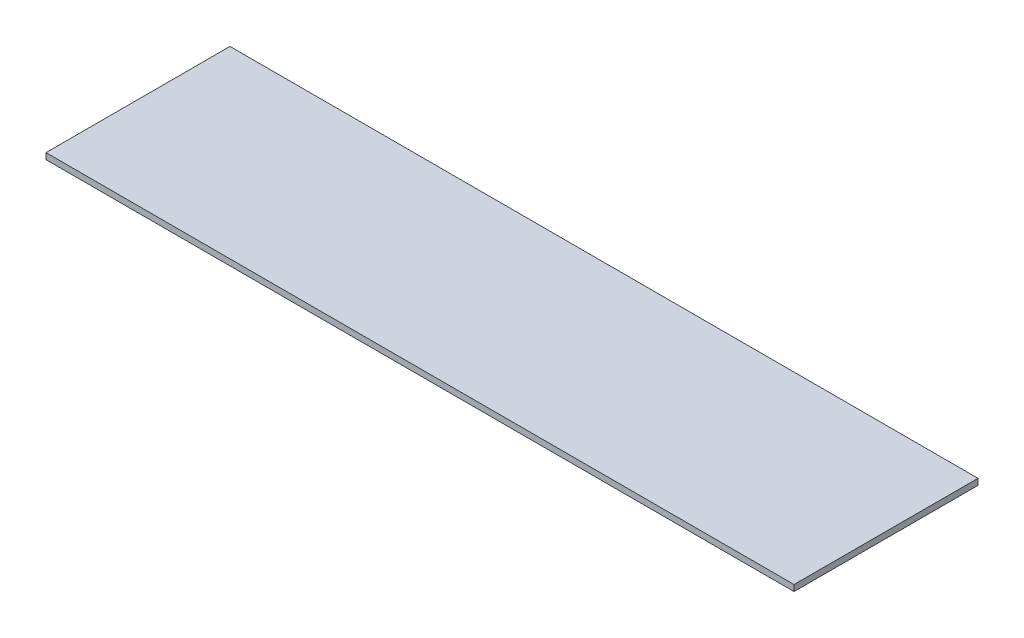
ISO-10303-21;
HEADER;
FILE_DESCRIPTION(('STEP AP214'),'2;1');
FILE_NAME('part.step','',(''),(''),'','','');
FILE_SCHEMA(('AUTOMOTIVE_DESIGN { 1 0 10303 214 1 1 1 1 }'));
ENDSEC;
DATA;
#1=APPLICATION_CONTEXT('core data for automotive mechanical design processes');
#2=APPLICATION_PROTOCOL_DEFINITION('international standard','automotive_design',2000,#1);
#3=PRODUCT_CONTEXT('',#1,'mechanical');
#4=PRODUCT('Part','Part','',(#3));
#5=PRODUCT_RELATED_PRODUCT_CATEGORY('part','',(#4));
#6=PRODUCT_DEFINITION_FORMATION('','',#4);
#7=PRODUCT_DEFINITION_CONTEXT('part definition',#1,'design');
#8=PRODUCT_DEFINITION('design','',#6,#7);
#9=PRODUCT_DEFINITION_SHAPE('','',#8);
#10=(LENGTH_UNIT() NAMED_UNIT(*) SI_UNIT(.MILLI.,.METRE.));
#11=(NAMED_UNIT(*) PLANE_ANGLE_UNIT() SI_UNIT($,.RADIAN.));
#12=(NAMED_UNIT(*) SI_UNIT($,.STERADIAN.) SOLID_ANGLE_UNIT());
#13=UNCERTAINTY_MEASURE_WITH_UNIT(LENGTH_MEASURE(1.E-05),#10,'distance_accuracy_value','');
#14=(GEOMETRIC_REPRESENTATION_CONTEXT(3) GLOBAL_UNCERTAINTY_ASSIGNED_CONTEXT((#13)) GLOBAL_UNIT_ASSIGNED_CONTEXT((#10,
#11,#12)) REPRESENTATION_CONTEXT('',''));
#15=CARTESIAN_POINT('',(0.,0.,0.));
#16=DIRECTION('',(0.,0.,1.));
#17=DIRECTION('',(1.,0.,0.));
#18=AXIS2_PLACEMENT_3D('',#15,#16,#17);
#19=CARTESIAN_POINT('',(0.,6.35,0.));
#20=DIRECTION('',(0.,1.,0.));
#21=DIRECTION('',(0.,0.,1.));
#22=AXIS2_PLACEMENT_3D('',#19,#20,#21);
#23=PLANE('',#22);
#24=DIRECTION('',(0.,0.,1.));
#25=VECTOR('',#24,1.);
#26=CARTESIAN_POINT('',(-387.350000000001,6.35,-95.249999999996));
#27=LINE('',#26,#25);
#28=CARTESIAN_POINT('',(-387.350000000001,6.35,-95.249999999996));
#29=VERTEX_POINT('',#28);
#30=CARTESIAN_POINT('',(-387.350000000001,6.35,95.250000000004));
#31=VERTEX_POINT('',#30);
#32=EDGE_CURVE('E78',#29,#31,#27,.T.);
#33=ORIENTED_EDGE('',*,*,#32,.T.);
#34=DIRECTION('',(1.,0.,0.));
#35=VECTOR('',#34,1.);
#36=CARTESIAN_POINT('',(-387.350000000001,6.35,95.250000000004));
#37=LINE('',#36,#35);
#38=CARTESIAN_POINT('',(387.349999999999,6.35,95.250000000004));
#39=VERTEX_POINT('',#38);
#40=EDGE_CURVE('E85',#31,#39,#37,.T.);
#41=ORIENTED_EDGE('',*,*,#40,.T.);
#42=DIRECTION('',(0.,0.,-1.));
#43=VECTOR('',#42,1.);
#44=CARTESIAN_POINT('',(387.349999999999,6.35,-95.249999999996));
#45=LINE('',#44,#43);
#46=CARTESIAN_POINT('',(387.349999999999,6.35,-95.249999999996));
#47=VERTEX_POINT('',#46);
#48=EDGE_CURVE('E91',#39,#47,#45,.T.);
#49=ORIENTED_EDGE('',*,*,#48,.T.);
#50=DIRECTION('',(-1.,0.,0.));
#51=VECTOR('',#50,1.);
#52=CARTESIAN_POINT('',(-387.350000000001,6.35,-95.249999999996));
#53=LINE('',#52,#51);
#54=EDGE_CURVE('E83',#47,#29,#53,.T.);
#55=ORIENTED_EDGE('',*,*,#54,.T.);
#56=EDGE_LOOP('',(#33,#41,#49,#55));
#57=FACE_BOUND('',#56,.T.);
#58=ADVANCED_FACE('F37',(#57),#23,.T.);
#59=CARTESIAN_POINT('',(-387.350000000001,-797.778377746602,95.250000000004));
#60=DIRECTION('',(0.,0.,1.));
#61=DIRECTION('',(1.,0.,0.));
#62=AXIS2_PLACEMENT_3D('',#59,#60,#61);
#63=PLANE('',#62);
#64=DIRECTION('',(-1.,0.,0.));
#65=VECTOR('',#64,1.);
#66=CARTESIAN_POINT('',(-387.350000000001,0.,95.250000000004));
#67=LINE('',#66,#65);
#68=CARTESIAN_POINT('',(387.349999999999,0.,95.250000000004));
#69=VERTEX_POINT('',#68);
#70=CARTESIAN_POINT('',(-387.350000000001,0.,95.250000000004));
#71=VERTEX_POINT('',#70);
#72=EDGE_CURVE('E11',#69,#71,#67,.T.);
#73=ORIENTED_EDGE('',*,*,#72,.F.);
#74=DIRECTION('',(0.,1.,0.));
#75=VECTOR('',#74,1.);
#76=CARTESIAN_POINT('',(387.349999999999,-797.778377746602,95.250000000004));
#77=LINE('',#76,#75);
#78=EDGE_CURVE('E82',#69,#39,#77,.T.);
#79=ORIENTED_EDGE('',*,*,#78,.T.);
#80=ORIENTED_EDGE('',*,*,#40,.F.);
#81=DIRECTION('',(0.,1.,0.));
#82=VECTOR('',#81,1.);
#83=CARTESIAN_POINT('',(-387.350000000001,-797.778377746602,95.250000000004));
#84=LINE('',#83,#82);
#85=EDGE_CURVE('E41',#71,#31,#84,.T.);
#86=ORIENTED_EDGE('',*,*,#85,.F.);
#87=EDGE_LOOP('',(#73,#79,#80,#86));
#88=FACE_BOUND('',#87,.T.);
#89=ADVANCED_FACE('F86',(#88),#63,.T.);
#90=CARTESIAN_POINT('',(387.349999999999,-797.778377746602,-95.249999999996));
#91=DIRECTION('',(1.,0.,0.));
#92=DIRECTION('',(0.,0.,-1.));
#93=AXIS2_PLACEMENT_3D('',#90,#91,#92);
#94=PLANE('',#93);
#95=DIRECTION('',(0.,0.,1.));
#96=VECTOR('',#95,1.);
#97=CARTESIAN_POINT('',(387.349999999999,0.,-95.249999999996));
#98=LINE('',#97,#96);
#99=CARTESIAN_POINT('',(387.349999999999,0.,-95.249999999996));
#100=VERTEX_POINT('',#99);
#101=EDGE_CURVE('E102',#100,#69,#98,.T.);
#102=ORIENTED_EDGE('',*,*,#101,.F.);
#103=DIRECTION('',(0.,1.,0.));
#104=VECTOR('',#103,1.);
#105=CARTESIAN_POINT('',(387.349999999999,-797.778377746602,-95.249999999996));
#106=LINE('',#105,#104);
#107=EDGE_CURVE('E103',#100,#47,#106,.T.);
#108=ORIENTED_EDGE('',*,*,#107,.T.);
#109=ORIENTED_EDGE('',*,*,#48,.F.);
#110=ORIENTED_EDGE('',*,*,#78,.F.);
#111=EDGE_LOOP('',(#102,#108,#109,#110));
#112=FACE_BOUND('',#111,.T.);
#113=ADVANCED_FACE('F107',(#112),#94,.T.);
#114=CARTESIAN_POINT('',(-387.350000000001,-797.778377746602,-95.249999999996));
#115=DIRECTION('',(0.,0.,-1.));
#116=DIRECTION('',(-1.,0.,0.));
#117=AXIS2_PLACEMENT_3D('',#114,#115,#116);
#118=PLANE('',#117);
#119=DIRECTION('',(1.,0.,0.));
#120=VECTOR('',#119,1.);
#121=CARTESIAN_POINT('',(-387.350000000001,0.,-95.249999999996));
#122=LINE('',#121,#120);
#123=CARTESIAN_POINT('',(-387.350000000001,0.,-95.249999999996));
#124=VERTEX_POINT('',#123);
#125=EDGE_CURVE('E110',#124,#100,#122,.T.);
#126=ORIENTED_EDGE('',*,*,#125,.F.);
#127=DIRECTION('',(0.,1.,0.));
#128=VECTOR('',#127,1.);
#129=CARTESIAN_POINT('',(-387.350000000001,-797.778377746602,-95.249999999996));
#130=LINE('',#129,#128);
#131=EDGE_CURVE('E100',#124,#29,#130,.T.);
#132=ORIENTED_EDGE('',*,*,#131,.T.);
#133=ORIENTED_EDGE('',*,*,#54,.F.);
#134=ORIENTED_EDGE('',*,*,#107,.F.);
#135=EDGE_LOOP('',(#126,#132,#133,#134));
#136=FACE_BOUND('',#135,.T.);
#137=ADVANCED_FACE('F109',(#136),#118,.T.);
#138=CARTESIAN_POINT('',(-387.350000000001,-797.778377746602,-95.249999999996));
#139=DIRECTION('',(-1.,0.,0.));
#140=DIRECTION('',(0.,0.,1.));
#141=AXIS2_PLACEMENT_3D('',#138,#139,#140);
#142=PLANE('',#141);
#143=DIRECTION('',(0.,0.,-1.));
#144=VECTOR('',#143,1.);
#145=CARTESIAN_POINT('',(-387.350000000001,0.,-95.249999999996));
#146=LINE('',#145,#144);
#147=EDGE_CURVE('E47',#71,#124,#146,.T.);
#148=ORIENTED_EDGE('',*,*,#147,.F.);
#149=ORIENTED_EDGE('',*,*,#85,.T.);
#150=ORIENTED_EDGE('',*,*,#32,.F.);
#151=ORIENTED_EDGE('',*,*,#131,.F.);
#152=EDGE_LOOP('',(#148,#149,#150,#151));
#153=FACE_BOUND('',#152,.T.);
#154=ADVANCED_FACE('F75',(#153),#142,.T.);
#155=CARTESIAN_POINT('',(0.,0.,0.));
#156=DIRECTION('',(0.,1.,0.));
#157=DIRECTION('',(0.,0.,1.));
#158=AXIS2_PLACEMENT_3D('',#155,#156,#157);
#159=PLANE('',#158);
#160=ORIENTED_EDGE('',*,*,#147,.T.);
#161=ORIENTED_EDGE('',*,*,#125,.T.);
#162=ORIENTED_EDGE('',*,*,#101,.T.);
#163=ORIENTED_EDGE('',*,*,#72,.T.);
#164=EDGE_LOOP('',(#160,#161,#162,#163));
#165=FACE_BOUND('',#164,.T.);
#166=ADVANCED_FACE('F39',(#165),#159,.F.);
#167=CLOSED_SHELL('',(#58,#89,#113,#137,#154,#166));
#168=MANIFOLD_SOLID_BREP('B2',#167);
#169=ADVANCED_BREP_SHAPE_REPRESENTATION('',(#18,#168),#14);
#170=SHAPE_DEFINITION_REPRESENTATION(#9,#169);
ENDSEC;
END-ISO-10303-21;
